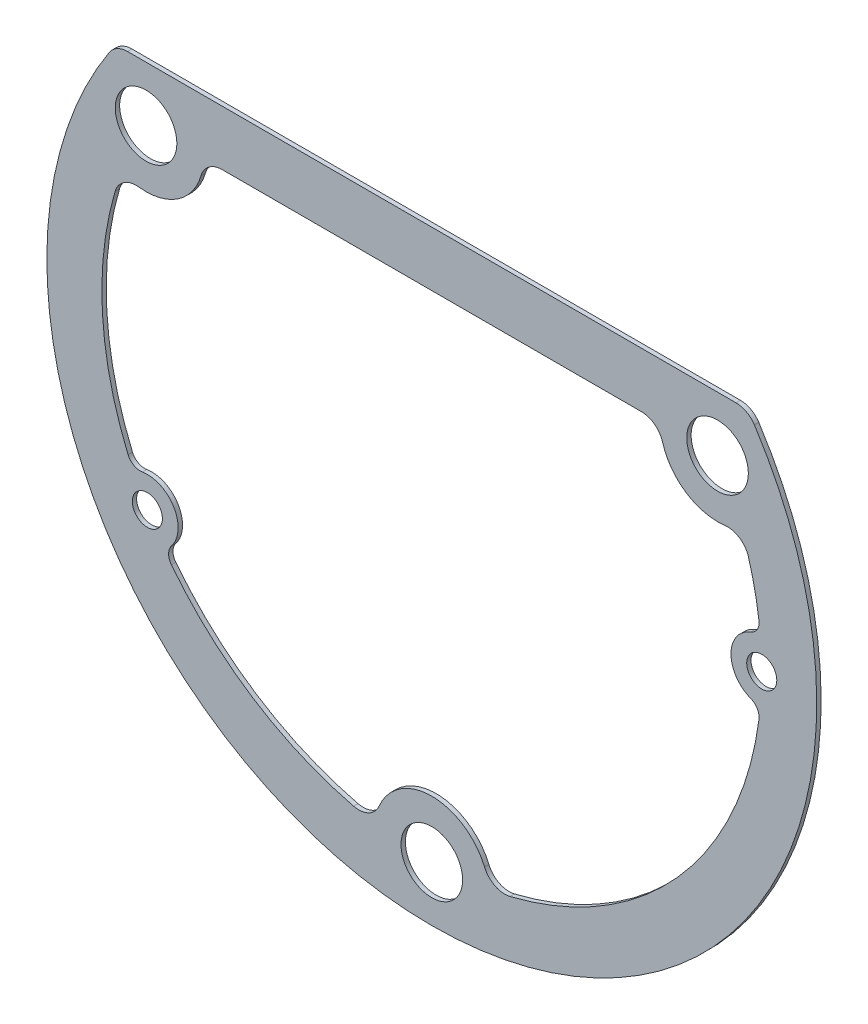
ISO-10303-21;
HEADER;
FILE_DESCRIPTION(('STEP AP214'),'2;1');
FILE_NAME('part.step','',(''),(''),'','','');
FILE_SCHEMA(('AUTOMOTIVE_DESIGN { 1 0 10303 214 1 1 1 1 }'));
ENDSEC;
DATA;
#1=APPLICATION_CONTEXT('core data for automotive mechanical design processes');
#2=APPLICATION_PROTOCOL_DEFINITION('international standard','automotive_design',2000,#1);
#3=PRODUCT_CONTEXT('',#1,'mechanical');
#4=PRODUCT('Part','Part','',(#3));
#5=PRODUCT_RELATED_PRODUCT_CATEGORY('part','',(#4));
#6=PRODUCT_DEFINITION_FORMATION('','',#4);
#7=PRODUCT_DEFINITION_CONTEXT('part definition',#1,'design');
#8=PRODUCT_DEFINITION('design','',#6,#7);
#9=PRODUCT_DEFINITION_SHAPE('','',#8);
#10=(LENGTH_UNIT() NAMED_UNIT(*) SI_UNIT(.MILLI.,.METRE.));
#11=(NAMED_UNIT(*) PLANE_ANGLE_UNIT() SI_UNIT($,.RADIAN.));
#12=(NAMED_UNIT(*) SI_UNIT($,.STERADIAN.) SOLID_ANGLE_UNIT());
#13=UNCERTAINTY_MEASURE_WITH_UNIT(LENGTH_MEASURE(1.E-05),#10,'distance_accuracy_value','');
#14=(GEOMETRIC_REPRESENTATION_CONTEXT(3) GLOBAL_UNCERTAINTY_ASSIGNED_CONTEXT((#13)) GLOBAL_UNIT_ASSIGNED_CONTEXT((#10,
#11,#12)) REPRESENTATION_CONTEXT('',''));
#15=CARTESIAN_POINT('',(0.,0.,0.));
#16=DIRECTION('',(0.,0.,1.));
#17=DIRECTION('',(1.,0.,0.));
#18=AXIS2_PLACEMENT_3D('',#15,#16,#17);
#19=CARTESIAN_POINT('',(69.1465834296966,45.,1.));
#20=DIRECTION('',(0.,0.,1.));
#21=DIRECTION('',(1.,0.,0.));
#22=AXIS2_PLACEMENT_3D('',#19,#20,#21);
#23=PLANE('',#22);
#24=CARTESIAN_POINT('',(75.,-5.2372220082647E-13,1.));
#25=DIRECTION('',(0.,0.,1.));
#26=DIRECTION('',(1.,0.,0.));
#27=AXIS2_PLACEMENT_3D('',#24,#25,#26);
#28=CIRCLE('',#27,3.4186046511628);
#29=CARTESIAN_POINT('',(78.4186046511628,-5.2372220082647E-13,1.));
#30=VERTEX_POINT('',#29);
#31=EDGE_CURVE('E462',#30,#30,#28,.T.);
#32=ORIENTED_EDGE('',*,*,#31,.F.);
#33=EDGE_LOOP('',(#32));
#34=FACE_BOUND('',#33,.T.);
#35=CARTESIAN_POINT('',(-64.6606526413089,-38.,1.));
#36=DIRECTION('',(0.,0.,1.));
#37=DIRECTION('',(1.,0.,0.));
#38=AXIS2_PLACEMENT_3D('',#35,#36,#37);
#39=CIRCLE('',#38,3.4186046511628);
#40=CARTESIAN_POINT('',(-61.2420479901461,-38.,1.));
#41=VERTEX_POINT('',#40);
#42=EDGE_CURVE('E461',#41,#41,#39,.T.);
#43=ORIENTED_EDGE('',*,*,#42,.F.);
#44=EDGE_LOOP('',(#43));
#45=FACE_BOUND('',#44,.T.);
#46=CARTESIAN_POINT('',(64.95,37.5032998548128,1.));
#47=DIRECTION('',(0.,0.,1.));
#48=DIRECTION('',(1.,0.,0.));
#49=AXIS2_PLACEMENT_3D('',#46,#47,#48);
#50=CIRCLE('',#49,7.);
#51=CARTESIAN_POINT('',(71.95,37.5032998548128,1.));
#52=VERTEX_POINT('',#51);
#53=EDGE_CURVE('E485',#52,#52,#50,.T.);
#54=ORIENTED_EDGE('',*,*,#53,.F.);
#55=EDGE_LOOP('',(#54));
#56=FACE_BOUND('',#55,.T.);
#57=CARTESIAN_POINT('',(0.,0.,1.));
#58=DIRECTION('',(0.,0.,1.));
#59=DIRECTION('',(1.,0.,0.));
#60=AXIS2_PLACEMENT_3D('',#57,#58,#59);
#61=CIRCLE('',#60,75.);
#62=CARTESIAN_POINT('',(17.7706462276119,-72.8642857142858,1.));
#63=VERTEX_POINT('',#62);
#64=CARTESIAN_POINT('',(74.3680555555555,-9.71557064128577,1.));
#65=VERTEX_POINT('',#64);
#66=EDGE_CURVE('E220',#63,#65,#61,.T.);
#67=ORIENTED_EDGE('',*,*,#66,.F.);
#68=CARTESIAN_POINT('',(16.5859364791045,-68.0066666666667,1.));
#69=DIRECTION('',(0.,0.,1.));
#70=DIRECTION('',(-1.,0.,0.));
#71=AXIS2_PLACEMENT_3D('',#68,#69,#70);
#72=CIRCLE('',#71,5.);
#73=CARTESIAN_POINT('',(11.9787319015755,-69.9492592592593,1.));
#74=VERTEX_POINT('',#73);
#75=EDGE_CURVE('E211',#74,#63,#72,.T.);
#76=ORIENTED_EDGE('',*,*,#75,.F.);
#77=CARTESIAN_POINT('',(0.,-75.,1.));
#78=DIRECTION('',(0.,0.,-1.));
#79=DIRECTION('',(1.,0.,0.));
#80=AXIS2_PLACEMENT_3D('',#77,#78,#79);
#81=CIRCLE('',#80,13.);
#82=CARTESIAN_POINT('',(-11.9787319015755,-69.9492592592593,1.));
#83=VERTEX_POINT('',#82);
#84=EDGE_CURVE('E290',#83,#74,#81,.T.);
#85=ORIENTED_EDGE('',*,*,#84,.F.);
#86=CARTESIAN_POINT('',(-16.5859364791045,-68.0066666666667,1.));
#87=DIRECTION('',(0.,0.,1.));
#88=DIRECTION('',(-1.,0.,0.));
#89=AXIS2_PLACEMENT_3D('',#86,#87,#88);
#90=CIRCLE('',#89,5.);
#91=CARTESIAN_POINT('',(-17.770646227612,-72.8642857142857,1.));
#92=VERTEX_POINT('',#91);
#93=EDGE_CURVE('E287',#92,#83,#90,.T.);
#94=ORIENTED_EDGE('',*,*,#93,.F.);
#95=CARTESIAN_POINT('',(0.,0.,1.));
#96=DIRECTION('',(0.,0.,1.));
#97=DIRECTION('',(1.,0.,0.));
#98=AXIS2_PLACEMENT_3D('',#95,#96,#97);
#99=CIRCLE('',#98,75.);
#100=CARTESIAN_POINT('',(-59.1932709802466,-46.0560166607914,1.));
#101=VERTEX_POINT('',#100);
#102=EDGE_CURVE('E284',#101,#92,#99,.T.);
#103=ORIENTED_EDGE('',*,*,#102,.F.);
#104=CARTESIAN_POINT('',(-56.8255401410368,-44.2137759943598,1.));
#105=DIRECTION('',(0.,0.,1.));
#106=DIRECTION('',(1.,0.,0.));
#107=AXIS2_PLACEMENT_3D('',#104,#105,#106);
#108=CIRCLE('',#107,3.);
#109=CARTESIAN_POINT('',(-59.1760738911184,-42.3496431960518,1.));
#110=VERTEX_POINT('',#109);
#111=EDGE_CURVE('E281',#110,#101,#108,.T.);
#112=ORIENTED_EDGE('',*,*,#111,.F.);
#113=CARTESIAN_POINT('',(-64.6606526413089,-38.,1.));
#114=DIRECTION('',(0.,0.,-1.));
#115=DIRECTION('',(1.,0.,0.));
#116=AXIS2_PLACEMENT_3D('',#113,#114,#115);
#117=CIRCLE('',#116,7.00000000000006);
#118=CARTESIAN_POINT('',(-65.791988875008,-31.0920279150593,1.));
#119=VERTEX_POINT('',#118);
#120=EDGE_CURVE('E278',#119,#110,#117,.T.);
#121=ORIENTED_EDGE('',*,*,#120,.F.);
#122=CARTESIAN_POINT('',(-66.2768472608791,-28.1314684500847,1.));
#123=DIRECTION('',(0.,0.,1.));
#124=DIRECTION('',(-1.,0.,0.));
#125=AXIS2_PLACEMENT_3D('',#122,#123,#124);
#126=CIRCLE('',#125,3.);
#127=CARTESIAN_POINT('',(-69.0383825634157,-29.3036129688382,1.));
#128=VERTEX_POINT('',#127);
#129=EDGE_CURVE('E275',#128,#119,#126,.T.);
#130=ORIENTED_EDGE('',*,*,#129,.F.);
#131=CARTESIAN_POINT('',(0.,0.,1.));
#132=DIRECTION('',(0.,0.,1.));
#133=DIRECTION('',(1.,0.,0.));
#134=AXIS2_PLACEMENT_3D('',#131,#132,#133);
#135=CIRCLE('',#134,75.);
#136=CARTESIAN_POINT('',(-71.9865764164105,21.0459691115495,1.));
#137=VERTEX_POINT('',#136);
#138=EDGE_CURVE('E272',#137,#128,#135,.T.);
#139=ORIENTED_EDGE('',*,*,#138,.F.);
#140=CARTESIAN_POINT('',(-67.1874713219832,19.6429045041129,1.));
#141=DIRECTION('',(0.,0.,1.));
#142=DIRECTION('',(-1.,0.,0.));
#143=AXIS2_PLACEMENT_3D('',#140,#141,#142);
#144=CIRCLE('',#143,5.);
#145=CARTESIAN_POINT('',(-66.5659515103212,24.6041254348629,1.));
#146=VERTEX_POINT('',#145);
#147=EDGE_CURVE('E269',#146,#137,#144,.T.);
#148=ORIENTED_EDGE('',*,*,#147,.F.);
#149=CARTESIAN_POINT('',(-64.95,37.5032998548128,1.));
#150=DIRECTION('',(0.,0.,-1.));
#151=DIRECTION('',(1.,0.,0.));
#152=AXIS2_PLACEMENT_3D('',#149,#150,#151);
#153=CIRCLE('',#152,13.);
#154=CARTESIAN_POINT('',(-52.4616103302624,33.8921887437017,1.));
#155=VERTEX_POINT('',#154);
#156=EDGE_CURVE('E266',#155,#146,#153,.T.);
#157=ORIENTED_EDGE('',*,*,#156,.F.);
#158=CARTESIAN_POINT('',(-47.6583835342094,32.5032998548128,1.));
#159=DIRECTION('',(0.,0.,1.));
#160=DIRECTION('',(1.,0.,0.));
#161=AXIS2_PLACEMENT_3D('',#158,#159,#160);
#162=CIRCLE('',#161,5.);
#163=CARTESIAN_POINT('',(-47.6583835342094,37.5032998548128,1.));
#164=VERTEX_POINT('',#163);
#165=EDGE_CURVE('E263',#164,#155,#162,.T.);
#166=ORIENTED_EDGE('',*,*,#165,.F.);
#167=DIRECTION('',(-1.,0.,0.));
#168=VECTOR('',#167,1.);
#169=CARTESIAN_POINT('',(-47.6583835342094,37.5032998548128,1.));
#170=LINE('',#169,#168);
#171=CARTESIAN_POINT('',(47.6583835342095,37.5032998548127,1.));
#172=VERTEX_POINT('',#171);
#173=EDGE_CURVE('E260',#172,#164,#170,.T.);
#174=ORIENTED_EDGE('',*,*,#173,.F.);
#175=CARTESIAN_POINT('',(47.6583835342094,32.5032998548127,1.));
#176=DIRECTION('',(0.,0.,1.));
#177=DIRECTION('',(-1.,0.,0.));
#178=AXIS2_PLACEMENT_3D('',#175,#176,#177);
#179=CIRCLE('',#178,5.);
#180=CARTESIAN_POINT('',(52.4616103302624,33.8921887437016,1.));
#181=VERTEX_POINT('',#180);
#182=EDGE_CURVE('E257',#181,#172,#179,.T.);
#183=ORIENTED_EDGE('',*,*,#182,.F.);
#184=CARTESIAN_POINT('',(64.95,37.5032998548128,1.));
#185=DIRECTION('',(0.,0.,-1.));
#186=DIRECTION('',(1.,0.,0.));
#187=AXIS2_PLACEMENT_3D('',#184,#185,#186);
#188=CIRCLE('',#187,13.);
#189=CARTESIAN_POINT('',(66.5659515103212,24.6041254348629,1.));
#190=VERTEX_POINT('',#189);
#191=EDGE_CURVE('E254',#190,#181,#188,.T.);
#192=ORIENTED_EDGE('',*,*,#191,.F.);
#193=CARTESIAN_POINT('',(67.1874713219832,19.6429045041129,1.));
#194=DIRECTION('',(0.,0.,1.));
#195=DIRECTION('',(1.,0.,0.));
#196=AXIS2_PLACEMENT_3D('',#193,#194,#195);
#197=CIRCLE('',#196,5.);
#198=CARTESIAN_POINT('',(71.9865764164105,21.0459691115495,1.));
#199=VERTEX_POINT('',#198);
#200=EDGE_CURVE('E251',#199,#190,#197,.T.);
#201=ORIENTED_EDGE('',*,*,#200,.F.);
#202=CARTESIAN_POINT('',(0.,0.,1.));
#203=DIRECTION('',(0.,0.,1.));
#204=DIRECTION('',(1.,0.,0.));
#205=AXIS2_PLACEMENT_3D('',#202,#203,#204);
#206=CIRCLE('',#205,75.);
#207=CARTESIAN_POINT('',(74.3680555555557,9.7155706412847,1.));
#208=VERTEX_POINT('',#207);
#209=EDGE_CURVE('E248',#208,#199,#206,.T.);
#210=ORIENTED_EDGE('',*,*,#209,.F.);
#211=CARTESIAN_POINT('',(71.3933333333334,9.32694781563331,1.));
#212=DIRECTION('',(0.,0.,1.));
#213=DIRECTION('',(-1.,0.,0.));
#214=AXIS2_PLACEMENT_3D('',#211,#212,#213);
#215=CIRCLE('',#214,3.);
#216=CARTESIAN_POINT('',(72.4753333333334,6.52886347094318,1.));
#217=VERTEX_POINT('',#216);
#218=EDGE_CURVE('E245',#217,#208,#215,.T.);
#219=ORIENTED_EDGE('',*,*,#218,.F.);
#220=CARTESIAN_POINT('',(75.,-5.2372220082647E-13,1.));
#221=DIRECTION('',(0.,0.,-1.));
#222=DIRECTION('',(1.,0.,0.));
#223=AXIS2_PLACEMENT_3D('',#220,#221,#222);
#224=CIRCLE('',#223,7.00000000000003);
#225=CARTESIAN_POINT('',(72.4753333333333,-6.52886347094418,1.));
#226=VERTEX_POINT('',#225);
#227=EDGE_CURVE('E239',#226,#217,#224,.T.);
#228=ORIENTED_EDGE('',*,*,#227,.F.);
#229=CARTESIAN_POINT('',(71.3933333333333,-9.32694781563431,1.));
#230=DIRECTION('',(0.,0.,1.));
#231=DIRECTION('',(1.,0.,0.));
#232=AXIS2_PLACEMENT_3D('',#229,#230,#231);
#233=CIRCLE('',#232,3.);
#234=EDGE_CURVE('E235',#65,#226,#233,.T.);
#235=ORIENTED_EDGE('',*,*,#234,.F.);
#236=EDGE_LOOP('',(#67,#76,#85,#94,#103,#112,#121,#130,#139,#148,#157,#166,#174,#183,#192,#201,
#210,#219,#228,#235));
#237=FACE_BOUND('',#236,.T.);
#238=CARTESIAN_POINT('',(69.1465834296966,45.,1.));
#239=DIRECTION('',(0.,0.,1.));
#240=DIRECTION('',(1.,0.,0.));
#241=AXIS2_PLACEMENT_3D('',#238,#239,#240);
#242=CIRCLE('',#241,5.);
#243=CARTESIAN_POINT('',(73.3372854557389,47.7272727272728,1.));
#244=VERTEX_POINT('',#243);
#245=CARTESIAN_POINT('',(69.1465834296966,50.,1.));
#246=VERTEX_POINT('',#245);
#247=EDGE_CURVE('E423',#244,#246,#242,.T.);
#248=ORIENTED_EDGE('',*,*,#247,.T.);
#249=DIRECTION('',(-1.,0.,0.));
#250=VECTOR('',#249,1.);
#251=CARTESIAN_POINT('',(-69.1465834296966,50.,1.));
#252=LINE('',#251,#250);
#253=CARTESIAN_POINT('',(-69.1465834296966,50.,1.));
#254=VERTEX_POINT('',#253);
#255=EDGE_CURVE('E427',#246,#254,#252,.T.);
#256=ORIENTED_EDGE('',*,*,#255,.T.);
#257=CARTESIAN_POINT('',(-69.1465834296966,45.,1.));
#258=DIRECTION('',(0.,0.,1.));
#259=DIRECTION('',(1.,0.,0.));
#260=AXIS2_PLACEMENT_3D('',#257,#258,#259);
#261=CIRCLE('',#260,5.);
#262=CARTESIAN_POINT('',(-73.3372854557389,47.7272727272727,1.));
#263=VERTEX_POINT('',#262);
#264=EDGE_CURVE('E431',#254,#263,#261,.T.);
#265=ORIENTED_EDGE('',*,*,#264,.T.);
#266=CARTESIAN_POINT('',(0.,0.,1.));
#267=DIRECTION('',(0.,0.,1.));
#268=DIRECTION('',(1.,0.,0.));
#269=AXIS2_PLACEMENT_3D('',#266,#267,#268);
#270=CIRCLE('',#269,87.5);
#271=EDGE_CURVE('E434',#263,#244,#270,.T.);
#272=ORIENTED_EDGE('',*,*,#271,.T.);
#273=EDGE_LOOP('',(#248,#256,#265,#272));
#274=FACE_BOUND('',#273,.T.);
#275=CARTESIAN_POINT('',(-64.95,37.5032998548128,1.));
#276=DIRECTION('',(0.,0.,1.));
#277=DIRECTION('',(1.,0.,0.));
#278=AXIS2_PLACEMENT_3D('',#275,#276,#277);
#279=CIRCLE('',#278,7.);
#280=CARTESIAN_POINT('',(-57.95,37.5032998548128,1.));
#281=VERTEX_POINT('',#280);
#282=EDGE_CURVE('E295',#281,#281,#279,.T.);
#283=ORIENTED_EDGE('',*,*,#282,.F.);
#284=EDGE_LOOP('',(#283));
#285=FACE_BOUND('',#284,.T.);
#286=CARTESIAN_POINT('',(0.,-75.,1.));
#287=DIRECTION('',(0.,0.,1.));
#288=DIRECTION('',(1.,0.,0.));
#289=AXIS2_PLACEMENT_3D('',#286,#287,#288);
#290=CIRCLE('',#289,7.);
#291=CARTESIAN_POINT('',(7.00000000000002,-75.,1.));
#292=VERTEX_POINT('',#291);
#293=EDGE_CURVE('E477',#292,#292,#290,.T.);
#294=ORIENTED_EDGE('',*,*,#293,.F.);
#295=EDGE_LOOP('',(#294));
#296=FACE_BOUND('',#295,.T.);
#297=ADVANCED_FACE('F47',(#34,#45,#56,#237,#274,#285,#296),#23,.T.);
#298=CARTESIAN_POINT('',(69.1465834296966,45.,0.));
#299=DIRECTION('',(0.,0.,1.));
#300=DIRECTION('',(1.,0.,0.));
#301=AXIS2_PLACEMENT_3D('',#298,#299,#300);
#302=PLANE('',#301);
#303=CARTESIAN_POINT('',(75.,-5.2372220082647E-13,0.));
#304=DIRECTION('',(0.,0.,1.));
#305=DIRECTION('',(1.,0.,0.));
#306=AXIS2_PLACEMENT_3D('',#303,#304,#305);
#307=CIRCLE('',#306,3.43604651162791);
#308=CARTESIAN_POINT('',(78.4360465116279,-5.2372220082647E-13,0.));
#309=VERTEX_POINT('',#308);
#310=EDGE_CURVE('E51',#309,#309,#307,.T.);
#311=ORIENTED_EDGE('',*,*,#310,.T.);
#312=EDGE_LOOP('',(#311));
#313=FACE_BOUND('',#312,.T.);
#314=CARTESIAN_POINT('',(-64.6606526413089,-38.,0.));
#315=DIRECTION('',(0.,0.,1.));
#316=DIRECTION('',(1.,0.,0.));
#317=AXIS2_PLACEMENT_3D('',#314,#315,#316);
#318=CIRCLE('',#317,3.43604651162791);
#319=CARTESIAN_POINT('',(-61.2246061296809,-38.,0.));
#320=VERTEX_POINT('',#319);
#321=EDGE_CURVE('E458',#320,#320,#318,.T.);
#322=ORIENTED_EDGE('',*,*,#321,.T.);
#323=EDGE_LOOP('',(#322));
#324=FACE_BOUND('',#323,.T.);
#325=CARTESIAN_POINT('',(69.1465834296966,45.,0.));
#326=DIRECTION('',(0.,0.,1.));
#327=DIRECTION('',(1.,0.,0.));
#328=AXIS2_PLACEMENT_3D('',#325,#326,#327);
#329=CIRCLE('',#328,5.);
#330=CARTESIAN_POINT('',(73.3372854557389,47.7272727272728,0.));
#331=VERTEX_POINT('',#330);
#332=CARTESIAN_POINT('',(69.1465834296966,50.,0.));
#333=VERTEX_POINT('',#332);
#334=EDGE_CURVE('E229',#331,#333,#329,.T.);
#335=ORIENTED_EDGE('',*,*,#334,.F.);
#336=CARTESIAN_POINT('',(0.,0.,0.));
#337=DIRECTION('',(0.,0.,1.));
#338=DIRECTION('',(1.,0.,0.));
#339=AXIS2_PLACEMENT_3D('',#336,#337,#338);
#340=CIRCLE('',#339,87.5);
#341=CARTESIAN_POINT('',(-73.3372854557389,47.7272727272727,0.));
#342=VERTEX_POINT('',#341);
#343=EDGE_CURVE('E428',#342,#331,#340,.T.);
#344=ORIENTED_EDGE('',*,*,#343,.F.);
#345=CARTESIAN_POINT('',(-69.1465834296966,45.,0.));
#346=DIRECTION('',(0.,0.,1.));
#347=DIRECTION('',(1.,0.,0.));
#348=AXIS2_PLACEMENT_3D('',#345,#346,#347);
#349=CIRCLE('',#348,5.);
#350=CARTESIAN_POINT('',(-69.1465834296966,50.,0.));
#351=VERTEX_POINT('',#350);
#352=EDGE_CURVE('E444',#351,#342,#349,.T.);
#353=ORIENTED_EDGE('',*,*,#352,.F.);
#354=DIRECTION('',(-1.,0.,0.));
#355=VECTOR('',#354,1.);
#356=CARTESIAN_POINT('',(-69.1465834296966,50.,0.));
#357=LINE('',#356,#355);
#358=EDGE_CURVE('E441',#333,#351,#357,.T.);
#359=ORIENTED_EDGE('',*,*,#358,.F.);
#360=EDGE_LOOP('',(#335,#344,#353,#359));
#361=FACE_BOUND('',#360,.T.);
#362=CARTESIAN_POINT('',(16.5859364791045,-68.0066666666667,0.));
#363=DIRECTION('',(0.,0.,1.));
#364=DIRECTION('',(-1.,0.,0.));
#365=AXIS2_PLACEMENT_3D('',#362,#363,#364);
#366=CIRCLE('',#365,5.);
#367=CARTESIAN_POINT('',(11.9787319015755,-69.9492592592593,0.));
#368=VERTEX_POINT('',#367);
#369=CARTESIAN_POINT('',(17.7706462276119,-72.8642857142858,0.));
#370=VERTEX_POINT('',#369);
#371=EDGE_CURVE('E73',#368,#370,#366,.T.);
#372=ORIENTED_EDGE('',*,*,#371,.T.);
#373=CARTESIAN_POINT('',(0.,0.,0.));
#374=DIRECTION('',(0.,0.,1.));
#375=DIRECTION('',(1.,0.,0.));
#376=AXIS2_PLACEMENT_3D('',#373,#374,#375);
#377=CIRCLE('',#376,75.);
#378=CARTESIAN_POINT('',(74.3680555555555,-9.71557064128577,0.));
#379=VERTEX_POINT('',#378);
#380=EDGE_CURVE('E227',#370,#379,#377,.T.);
#381=ORIENTED_EDGE('',*,*,#380,.T.);
#382=CARTESIAN_POINT('',(71.3933333333333,-9.32694781563431,0.));
#383=DIRECTION('',(0.,0.,1.));
#384=DIRECTION('',(1.,0.,0.));
#385=AXIS2_PLACEMENT_3D('',#382,#383,#384);
#386=CIRCLE('',#385,3.);
#387=CARTESIAN_POINT('',(72.4753333333333,-6.52886347094418,0.));
#388=VERTEX_POINT('',#387);
#389=EDGE_CURVE('E298',#379,#388,#386,.T.);
#390=ORIENTED_EDGE('',*,*,#389,.T.);
#391=CARTESIAN_POINT('',(75.,-5.2372220082647E-13,0.));
#392=DIRECTION('',(0.,0.,-1.));
#393=DIRECTION('',(1.,0.,0.));
#394=AXIS2_PLACEMENT_3D('',#391,#392,#393);
#395=CIRCLE('',#394,7.00000000000003);
#396=CARTESIAN_POINT('',(72.4753333333334,6.52886347094318,0.));
#397=VERTEX_POINT('',#396);
#398=EDGE_CURVE('E302',#388,#397,#395,.T.);
#399=ORIENTED_EDGE('',*,*,#398,.T.);
#400=CARTESIAN_POINT('',(71.3933333333334,9.32694781563331,0.));
#401=DIRECTION('',(0.,0.,1.));
#402=DIRECTION('',(-1.,0.,0.));
#403=AXIS2_PLACEMENT_3D('',#400,#401,#402);
#404=CIRCLE('',#403,3.);
#405=CARTESIAN_POINT('',(74.3680555555557,9.7155706412847,0.));
#406=VERTEX_POINT('',#405);
#407=EDGE_CURVE('E306',#397,#406,#404,.T.);
#408=ORIENTED_EDGE('',*,*,#407,.T.);
#409=CARTESIAN_POINT('',(0.,0.,0.));
#410=DIRECTION('',(0.,0.,1.));
#411=DIRECTION('',(1.,0.,0.));
#412=AXIS2_PLACEMENT_3D('',#409,#410,#411);
#413=CIRCLE('',#412,75.);
#414=CARTESIAN_POINT('',(71.9865764164105,21.0459691115495,0.));
#415=VERTEX_POINT('',#414);
#416=EDGE_CURVE('E310',#406,#415,#413,.T.);
#417=ORIENTED_EDGE('',*,*,#416,.T.);
#418=CARTESIAN_POINT('',(67.1874713219832,19.6429045041129,0.));
#419=DIRECTION('',(0.,0.,1.));
#420=DIRECTION('',(1.,0.,0.));
#421=AXIS2_PLACEMENT_3D('',#418,#419,#420);
#422=CIRCLE('',#421,5.);
#423=CARTESIAN_POINT('',(66.5659515103212,24.6041254348629,0.));
#424=VERTEX_POINT('',#423);
#425=EDGE_CURVE('E314',#415,#424,#422,.T.);
#426=ORIENTED_EDGE('',*,*,#425,.T.);
#427=CARTESIAN_POINT('',(64.95,37.5032998548128,0.));
#428=DIRECTION('',(0.,0.,-1.));
#429=DIRECTION('',(1.,0.,0.));
#430=AXIS2_PLACEMENT_3D('',#427,#428,#429);
#431=CIRCLE('',#430,13.);
#432=CARTESIAN_POINT('',(52.4616103302624,33.8921887437016,0.));
#433=VERTEX_POINT('',#432);
#434=EDGE_CURVE('E318',#424,#433,#431,.T.);
#435=ORIENTED_EDGE('',*,*,#434,.T.);
#436=CARTESIAN_POINT('',(47.6583835342094,32.5032998548127,0.));
#437=DIRECTION('',(0.,0.,1.));
#438=DIRECTION('',(-1.,0.,0.));
#439=AXIS2_PLACEMENT_3D('',#436,#437,#438);
#440=CIRCLE('',#439,5.);
#441=CARTESIAN_POINT('',(47.6583835342095,37.5032998548127,0.));
#442=VERTEX_POINT('',#441);
#443=EDGE_CURVE('E322',#433,#442,#440,.T.);
#444=ORIENTED_EDGE('',*,*,#443,.T.);
#445=DIRECTION('',(-1.,0.,0.));
#446=VECTOR('',#445,1.);
#447=CARTESIAN_POINT('',(-47.6583835342094,37.5032998548128,0.));
#448=LINE('',#447,#446);
#449=CARTESIAN_POINT('',(-47.6583835342094,37.5032998548128,0.));
#450=VERTEX_POINT('',#449);
#451=EDGE_CURVE('E326',#442,#450,#448,.T.);
#452=ORIENTED_EDGE('',*,*,#451,.T.);
#453=CARTESIAN_POINT('',(-47.6583835342094,32.5032998548128,0.));
#454=DIRECTION('',(0.,0.,1.));
#455=DIRECTION('',(1.,0.,0.));
#456=AXIS2_PLACEMENT_3D('',#453,#454,#455);
#457=CIRCLE('',#456,5.);
#458=CARTESIAN_POINT('',(-52.4616103302624,33.8921887437017,0.));
#459=VERTEX_POINT('',#458);
#460=EDGE_CURVE('E330',#450,#459,#457,.T.);
#461=ORIENTED_EDGE('',*,*,#460,.T.);
#462=CARTESIAN_POINT('',(-64.95,37.5032998548128,0.));
#463=DIRECTION('',(0.,0.,-1.));
#464=DIRECTION('',(1.,0.,0.));
#465=AXIS2_PLACEMENT_3D('',#462,#463,#464);
#466=CIRCLE('',#465,13.);
#467=CARTESIAN_POINT('',(-66.5659515103212,24.6041254348629,0.));
#468=VERTEX_POINT('',#467);
#469=EDGE_CURVE('E334',#459,#468,#466,.T.);
#470=ORIENTED_EDGE('',*,*,#469,.T.);
#471=CARTESIAN_POINT('',(-67.1874713219832,19.6429045041129,0.));
#472=DIRECTION('',(0.,0.,1.));
#473=DIRECTION('',(-1.,0.,0.));
#474=AXIS2_PLACEMENT_3D('',#471,#472,#473);
#475=CIRCLE('',#474,5.);
#476=CARTESIAN_POINT('',(-71.9865764164105,21.0459691115495,0.));
#477=VERTEX_POINT('',#476);
#478=EDGE_CURVE('E338',#468,#477,#475,.T.);
#479=ORIENTED_EDGE('',*,*,#478,.T.);
#480=CARTESIAN_POINT('',(0.,0.,0.));
#481=DIRECTION('',(0.,0.,1.));
#482=DIRECTION('',(1.,0.,0.));
#483=AXIS2_PLACEMENT_3D('',#480,#481,#482);
#484=CIRCLE('',#483,75.);
#485=CARTESIAN_POINT('',(-69.0383825634157,-29.3036129688382,0.));
#486=VERTEX_POINT('',#485);
#487=EDGE_CURVE('E342',#477,#486,#484,.T.);
#488=ORIENTED_EDGE('',*,*,#487,.T.);
#489=CARTESIAN_POINT('',(-66.2768472608791,-28.1314684500847,0.));
#490=DIRECTION('',(0.,0.,1.));
#491=DIRECTION('',(-1.,0.,0.));
#492=AXIS2_PLACEMENT_3D('',#489,#490,#491);
#493=CIRCLE('',#492,3.);
#494=CARTESIAN_POINT('',(-65.791988875008,-31.0920279150593,0.));
#495=VERTEX_POINT('',#494);
#496=EDGE_CURVE('E346',#486,#495,#493,.T.);
#497=ORIENTED_EDGE('',*,*,#496,.T.);
#498=CARTESIAN_POINT('',(-64.6606526413089,-38.,0.));
#499=DIRECTION('',(0.,0.,-1.));
#500=DIRECTION('',(1.,0.,0.));
#501=AXIS2_PLACEMENT_3D('',#498,#499,#500);
#502=CIRCLE('',#501,7.00000000000006);
#503=CARTESIAN_POINT('',(-59.1760738911184,-42.3496431960518,0.));
#504=VERTEX_POINT('',#503);
#505=EDGE_CURVE('E350',#495,#504,#502,.T.);
#506=ORIENTED_EDGE('',*,*,#505,.T.);
#507=CARTESIAN_POINT('',(-56.8255401410368,-44.2137759943598,0.));
#508=DIRECTION('',(0.,0.,1.));
#509=DIRECTION('',(1.,0.,0.));
#510=AXIS2_PLACEMENT_3D('',#507,#508,#509);
#511=CIRCLE('',#510,3.);
#512=CARTESIAN_POINT('',(-59.1932709802466,-46.0560166607914,0.));
#513=VERTEX_POINT('',#512);
#514=EDGE_CURVE('E354',#504,#513,#511,.T.);
#515=ORIENTED_EDGE('',*,*,#514,.T.);
#516=CARTESIAN_POINT('',(0.,0.,0.));
#517=DIRECTION('',(0.,0.,1.));
#518=DIRECTION('',(1.,0.,0.));
#519=AXIS2_PLACEMENT_3D('',#516,#517,#518);
#520=CIRCLE('',#519,75.);
#521=CARTESIAN_POINT('',(-17.770646227612,-72.8642857142857,0.));
#522=VERTEX_POINT('',#521);
#523=EDGE_CURVE('E358',#513,#522,#520,.T.);
#524=ORIENTED_EDGE('',*,*,#523,.T.);
#525=CARTESIAN_POINT('',(-16.5859364791045,-68.0066666666667,0.));
#526=DIRECTION('',(0.,0.,1.));
#527=DIRECTION('',(-1.,0.,0.));
#528=AXIS2_PLACEMENT_3D('',#525,#526,#527);
#529=CIRCLE('',#528,5.);
#530=CARTESIAN_POINT('',(-11.9787319015755,-69.9492592592593,0.));
#531=VERTEX_POINT('',#530);
#532=EDGE_CURVE('E362',#522,#531,#529,.T.);
#533=ORIENTED_EDGE('',*,*,#532,.T.);
#534=CARTESIAN_POINT('',(0.,-75.,0.));
#535=DIRECTION('',(0.,0.,-1.));
#536=DIRECTION('',(1.,0.,0.));
#537=AXIS2_PLACEMENT_3D('',#534,#535,#536);
#538=CIRCLE('',#537,13.);
#539=EDGE_CURVE('E221',#531,#368,#538,.T.);
#540=ORIENTED_EDGE('',*,*,#539,.T.);
#541=EDGE_LOOP('',(#372,#381,#390,#399,#408,#417,#426,#435,#444,#452,#461,#470,#479,#488,#497,
#506,#515,#524,#533,#540));
#542=FACE_BOUND('',#541,.T.);
#543=CARTESIAN_POINT('',(-64.95,37.5032998548128,0.));
#544=DIRECTION('',(0.,0.,1.));
#545=DIRECTION('',(1.,0.,0.));
#546=AXIS2_PLACEMENT_3D('',#543,#544,#545);
#547=CIRCLE('',#546,7.);
#548=CARTESIAN_POINT('',(-57.95,37.5032998548128,0.));
#549=VERTEX_POINT('',#548);
#550=EDGE_CURVE('E489',#549,#549,#547,.T.);
#551=ORIENTED_EDGE('',*,*,#550,.T.);
#552=EDGE_LOOP('',(#551));
#553=FACE_BOUND('',#552,.T.);
#554=CARTESIAN_POINT('',(64.95,37.5032998548128,0.));
#555=DIRECTION('',(0.,0.,1.));
#556=DIRECTION('',(1.,0.,0.));
#557=AXIS2_PLACEMENT_3D('',#554,#555,#556);
#558=CIRCLE('',#557,7.);
#559=CARTESIAN_POINT('',(71.95,37.5032998548128,0.));
#560=VERTEX_POINT('',#559);
#561=EDGE_CURVE('E481',#560,#560,#558,.T.);
#562=ORIENTED_EDGE('',*,*,#561,.T.);
#563=EDGE_LOOP('',(#562));
#564=FACE_BOUND('',#563,.T.);
#565=CARTESIAN_POINT('',(0.,-75.,0.));
#566=DIRECTION('',(0.,0.,1.));
#567=DIRECTION('',(1.,0.,0.));
#568=AXIS2_PLACEMENT_3D('',#565,#566,#567);
#569=CIRCLE('',#568,7.);
#570=CARTESIAN_POINT('',(7.00000000000002,-75.,0.));
#571=VERTEX_POINT('',#570);
#572=EDGE_CURVE('E468',#571,#571,#569,.T.);
#573=ORIENTED_EDGE('',*,*,#572,.T.);
#574=EDGE_LOOP('',(#573));
#575=FACE_BOUND('',#574,.T.);
#576=ADVANCED_FACE('F499',(#313,#324,#361,#542,#553,#564,#575),#302,.F.);
#577=CARTESIAN_POINT('',(69.1465834296966,45.,1.));
#578=DIRECTION('',(0.,0.,-1.));
#579=DIRECTION('',(-1.,0.,0.));
#580=AXIS2_PLACEMENT_3D('',#577,#578,#579);
#581=CYLINDRICAL_SURFACE('',#580,5.);
#582=ORIENTED_EDGE('',*,*,#334,.T.);
#583=DIRECTION('',(0.,0.,-1.));
#584=VECTOR('',#583,1.);
#585=CARTESIAN_POINT('',(69.1465834296966,50.,1.));
#586=LINE('',#585,#584);
#587=EDGE_CURVE('E12',#246,#333,#586,.T.);
#588=ORIENTED_EDGE('',*,*,#587,.F.);
#589=ORIENTED_EDGE('',*,*,#247,.F.);
#590=DIRECTION('',(0.,0.,-1.));
#591=VECTOR('',#590,1.);
#592=CARTESIAN_POINT('',(73.3372854557389,47.7272727272728,1.));
#593=LINE('',#592,#591);
#594=EDGE_CURVE('E437',#244,#331,#593,.T.);
#595=ORIENTED_EDGE('',*,*,#594,.T.);
#596=EDGE_LOOP('',(#582,#588,#589,#595));
#597=FACE_BOUND('',#596,.T.);
#598=ADVANCED_FACE('F49',(#597),#581,.T.);
#599=CARTESIAN_POINT('',(-69.1465834296966,50.,1.));
#600=DIRECTION('',(0.,-1.,0.));
#601=DIRECTION('',(0.,0.,-1.));
#602=AXIS2_PLACEMENT_3D('',#599,#600,#601);
#603=PLANE('',#602);
#604=ORIENTED_EDGE('',*,*,#358,.T.);
#605=DIRECTION('',(0.,0.,-1.));
#606=VECTOR('',#605,1.);
#607=CARTESIAN_POINT('',(-69.1465834296966,50.,1.));
#608=LINE('',#607,#606);
#609=EDGE_CURVE('E57',#254,#351,#608,.T.);
#610=ORIENTED_EDGE('',*,*,#609,.F.);
#611=ORIENTED_EDGE('',*,*,#255,.F.);
#612=ORIENTED_EDGE('',*,*,#587,.T.);
#613=EDGE_LOOP('',(#604,#610,#611,#612));
#614=FACE_BOUND('',#613,.T.);
#615=ADVANCED_FACE('F535',(#614),#603,.F.);
#616=CARTESIAN_POINT('',(-69.1465834296966,45.,1.));
#617=DIRECTION('',(0.,0.,-1.));
#618=DIRECTION('',(-1.,0.,0.));
#619=AXIS2_PLACEMENT_3D('',#616,#617,#618);
#620=CYLINDRICAL_SURFACE('',#619,5.);
#621=ORIENTED_EDGE('',*,*,#352,.T.);
#622=DIRECTION('',(0.,0.,-1.));
#623=VECTOR('',#622,1.);
#624=CARTESIAN_POINT('',(-73.3372854557389,47.7272727272727,1.));
#625=LINE('',#624,#623);
#626=EDGE_CURVE('E452',#263,#342,#625,.T.);
#627=ORIENTED_EDGE('',*,*,#626,.F.);
#628=ORIENTED_EDGE('',*,*,#264,.F.);
#629=ORIENTED_EDGE('',*,*,#609,.T.);
#630=EDGE_LOOP('',(#621,#627,#628,#629));
#631=FACE_BOUND('',#630,.T.);
#632=ADVANCED_FACE('F532',(#631),#620,.T.);
#633=CARTESIAN_POINT('',(0.,0.,1.));
#634=DIRECTION('',(0.,0.,-1.));
#635=DIRECTION('',(-1.,0.,0.));
#636=AXIS2_PLACEMENT_3D('',#633,#634,#635);
#637=CYLINDRICAL_SURFACE('',#636,87.5);
#638=ORIENTED_EDGE('',*,*,#343,.T.);
#639=ORIENTED_EDGE('',*,*,#594,.F.);
#640=ORIENTED_EDGE('',*,*,#271,.F.);
#641=ORIENTED_EDGE('',*,*,#626,.T.);
#642=EDGE_LOOP('',(#638,#639,#640,#641));
#643=FACE_BOUND('',#642,.T.);
#644=ADVANCED_FACE('F529',(#643),#637,.T.);
#645=CARTESIAN_POINT('',(16.5859364791045,-68.0066666666667,1.));
#646=DIRECTION('',(0.,0.,-1.));
#647=DIRECTION('',(-1.,0.,0.));
#648=AXIS2_PLACEMENT_3D('',#645,#646,#647);
#649=CYLINDRICAL_SURFACE('',#648,5.);
#650=ORIENTED_EDGE('',*,*,#371,.F.);
#651=DIRECTION('',(0.,0.,-1.));
#652=VECTOR('',#651,1.);
#653=CARTESIAN_POINT('',(11.9787319015755,-69.9492592592593,1.));
#654=LINE('',#653,#652);
#655=EDGE_CURVE('E215',#74,#368,#654,.T.);
#656=ORIENTED_EDGE('',*,*,#655,.F.);
#657=ORIENTED_EDGE('',*,*,#75,.T.);
#658=DIRECTION('',(0.,0.,-1.));
#659=VECTOR('',#658,1.);
#660=CARTESIAN_POINT('',(17.7706462276119,-72.8642857142858,1.));
#661=LINE('',#660,#659);
#662=EDGE_CURVE('E214',#63,#370,#661,.T.);
#663=ORIENTED_EDGE('',*,*,#662,.T.);
#664=EDGE_LOOP('',(#650,#656,#657,#663));
#665=FACE_BOUND('',#664,.T.);
#666=ADVANCED_FACE('F213',(#665),#649,.F.);
#667=CARTESIAN_POINT('',(0.,0.,1.));
#668=DIRECTION('',(0.,0.,-1.));
#669=DIRECTION('',(-1.,0.,0.));
#670=AXIS2_PLACEMENT_3D('',#667,#668,#669);
#671=CYLINDRICAL_SURFACE('',#670,75.);
#672=ORIENTED_EDGE('',*,*,#380,.F.);
#673=ORIENTED_EDGE('',*,*,#662,.F.);
#674=ORIENTED_EDGE('',*,*,#66,.T.);
#675=DIRECTION('',(0.,0.,-1.));
#676=VECTOR('',#675,1.);
#677=CARTESIAN_POINT('',(74.3680555555555,-9.71557064128577,1.));
#678=LINE('',#677,#676);
#679=EDGE_CURVE('E230',#65,#379,#678,.T.);
#680=ORIENTED_EDGE('',*,*,#679,.T.);
#681=EDGE_LOOP('',(#672,#673,#674,#680));
#682=FACE_BOUND('',#681,.T.);
#683=ADVANCED_FACE('F224',(#682),#671,.F.);
#684=CARTESIAN_POINT('',(71.3933333333333,-9.32694781563431,1.));
#685=DIRECTION('',(0.,0.,-1.));
#686=DIRECTION('',(-1.,0.,0.));
#687=AXIS2_PLACEMENT_3D('',#684,#685,#686);
#688=CYLINDRICAL_SURFACE('',#687,3.);
#689=ORIENTED_EDGE('',*,*,#389,.F.);
#690=ORIENTED_EDGE('',*,*,#679,.F.);
#691=ORIENTED_EDGE('',*,*,#234,.T.);
#692=DIRECTION('',(0.,0.,-1.));
#693=VECTOR('',#692,1.);
#694=CARTESIAN_POINT('',(72.4753333333333,-6.52886347094418,1.));
#695=LINE('',#694,#693);
#696=EDGE_CURVE('E418',#226,#388,#695,.T.);
#697=ORIENTED_EDGE('',*,*,#696,.T.);
#698=EDGE_LOOP('',(#689,#690,#691,#697));
#699=FACE_BOUND('',#698,.T.);
#700=ADVANCED_FACE('F641',(#699),#688,.F.);
#701=CARTESIAN_POINT('',(75.,-5.2372220082647E-13,1.));
#702=DIRECTION('',(0.,0.,-1.));
#703=DIRECTION('',(-1.,0.,0.));
#704=AXIS2_PLACEMENT_3D('',#701,#702,#703);
#705=CYLINDRICAL_SURFACE('',#704,7.00000000000003);
#706=ORIENTED_EDGE('',*,*,#398,.F.);
#707=ORIENTED_EDGE('',*,*,#696,.F.);
#708=ORIENTED_EDGE('',*,*,#227,.T.);
#709=DIRECTION('',(0.,0.,-1.));
#710=VECTOR('',#709,1.);
#711=CARTESIAN_POINT('',(72.4753333333334,6.52886347094318,1.));
#712=LINE('',#711,#710);
#713=EDGE_CURVE('E415',#217,#397,#712,.T.);
#714=ORIENTED_EDGE('',*,*,#713,.T.);
#715=EDGE_LOOP('',(#706,#707,#708,#714));
#716=FACE_BOUND('',#715,.T.);
#717=ADVANCED_FACE('F650',(#716),#705,.T.);
#718=CARTESIAN_POINT('',(71.3933333333334,9.32694781563331,1.));
#719=DIRECTION('',(0.,0.,-1.));
#720=DIRECTION('',(-1.,0.,0.));
#721=AXIS2_PLACEMENT_3D('',#718,#719,#720);
#722=CYLINDRICAL_SURFACE('',#721,3.);
#723=ORIENTED_EDGE('',*,*,#407,.F.);
#724=ORIENTED_EDGE('',*,*,#713,.F.);
#725=ORIENTED_EDGE('',*,*,#218,.T.);
#726=DIRECTION('',(0.,0.,-1.));
#727=VECTOR('',#726,1.);
#728=CARTESIAN_POINT('',(74.3680555555557,9.7155706412847,1.));
#729=LINE('',#728,#727);
#730=EDGE_CURVE('E412',#208,#406,#729,.T.);
#731=ORIENTED_EDGE('',*,*,#730,.T.);
#732=EDGE_LOOP('',(#723,#724,#725,#731));
#733=FACE_BOUND('',#732,.T.);
#734=ADVANCED_FACE('F661',(#733),#722,.F.);
#735=CARTESIAN_POINT('',(0.,0.,1.));
#736=DIRECTION('',(0.,0.,-1.));
#737=DIRECTION('',(-1.,0.,0.));
#738=AXIS2_PLACEMENT_3D('',#735,#736,#737);
#739=CYLINDRICAL_SURFACE('',#738,75.);
#740=ORIENTED_EDGE('',*,*,#416,.F.);
#741=ORIENTED_EDGE('',*,*,#730,.F.);
#742=ORIENTED_EDGE('',*,*,#209,.T.);
#743=DIRECTION('',(0.,0.,-1.));
#744=VECTOR('',#743,1.);
#745=CARTESIAN_POINT('',(71.9865764164105,21.0459691115495,1.));
#746=LINE('',#745,#744);
#747=EDGE_CURVE('E409',#199,#415,#746,.T.);
#748=ORIENTED_EDGE('',*,*,#747,.T.);
#749=EDGE_LOOP('',(#740,#741,#742,#748));
#750=FACE_BOUND('',#749,.T.);
#751=ADVANCED_FACE('F672',(#750),#739,.F.);
#752=CARTESIAN_POINT('',(67.1874713219832,19.6429045041129,1.));
#753=DIRECTION('',(0.,0.,-1.));
#754=DIRECTION('',(-1.,0.,0.));
#755=AXIS2_PLACEMENT_3D('',#752,#753,#754);
#756=CYLINDRICAL_SURFACE('',#755,5.);
#757=ORIENTED_EDGE('',*,*,#425,.F.);
#758=ORIENTED_EDGE('',*,*,#747,.F.);
#759=ORIENTED_EDGE('',*,*,#200,.T.);
#760=DIRECTION('',(0.,0.,-1.));
#761=VECTOR('',#760,1.);
#762=CARTESIAN_POINT('',(66.5659515103212,24.6041254348629,1.));
#763=LINE('',#762,#761);
#764=EDGE_CURVE('E406',#190,#424,#763,.T.);
#765=ORIENTED_EDGE('',*,*,#764,.T.);
#766=EDGE_LOOP('',(#757,#758,#759,#765));
#767=FACE_BOUND('',#766,.T.);
#768=ADVANCED_FACE('F683',(#767),#756,.F.);
#769=CARTESIAN_POINT('',(64.95,37.5032998548128,1.));
#770=DIRECTION('',(0.,0.,-1.));
#771=DIRECTION('',(-1.,0.,0.));
#772=AXIS2_PLACEMENT_3D('',#769,#770,#771);
#773=CYLINDRICAL_SURFACE('',#772,13.);
#774=ORIENTED_EDGE('',*,*,#434,.F.);
#775=ORIENTED_EDGE('',*,*,#764,.F.);
#776=ORIENTED_EDGE('',*,*,#191,.T.);
#777=DIRECTION('',(0.,0.,-1.));
#778=VECTOR('',#777,1.);
#779=CARTESIAN_POINT('',(52.4616103302624,33.8921887437016,1.));
#780=LINE('',#779,#778);
#781=EDGE_CURVE('E403',#181,#433,#780,.T.);
#782=ORIENTED_EDGE('',*,*,#781,.T.);
#783=EDGE_LOOP('',(#774,#775,#776,#782));
#784=FACE_BOUND('',#783,.T.);
#785=ADVANCED_FACE('F694',(#784),#773,.T.);
#786=CARTESIAN_POINT('',(47.6583835342094,32.5032998548127,1.));
#787=DIRECTION('',(0.,0.,-1.));
#788=DIRECTION('',(-1.,0.,0.));
#789=AXIS2_PLACEMENT_3D('',#786,#787,#788);
#790=CYLINDRICAL_SURFACE('',#789,5.);
#791=ORIENTED_EDGE('',*,*,#443,.F.);
#792=ORIENTED_EDGE('',*,*,#781,.F.);
#793=ORIENTED_EDGE('',*,*,#182,.T.);
#794=DIRECTION('',(0.,0.,-1.));
#795=VECTOR('',#794,1.);
#796=CARTESIAN_POINT('',(47.6583835342095,37.5032998548127,1.));
#797=LINE('',#796,#795);
#798=EDGE_CURVE('E400',#172,#442,#797,.T.);
#799=ORIENTED_EDGE('',*,*,#798,.T.);
#800=EDGE_LOOP('',(#791,#792,#793,#799));
#801=FACE_BOUND('',#800,.T.);
#802=ADVANCED_FACE('F705',(#801),#790,.F.);
#803=CARTESIAN_POINT('',(-47.6583835342094,37.5032998548128,1.));
#804=DIRECTION('',(0.,-1.,0.));
#805=DIRECTION('',(1.,0.,0.));
#806=AXIS2_PLACEMENT_3D('',#803,#804,#805);
#807=PLANE('',#806);
#808=ORIENTED_EDGE('',*,*,#451,.F.);
#809=ORIENTED_EDGE('',*,*,#798,.F.);
#810=ORIENTED_EDGE('',*,*,#173,.T.);
#811=DIRECTION('',(0.,0.,-1.));
#812=VECTOR('',#811,1.);
#813=CARTESIAN_POINT('',(-47.6583835342094,37.5032998548128,1.));
#814=LINE('',#813,#812);
#815=EDGE_CURVE('E397',#164,#450,#814,.T.);
#816=ORIENTED_EDGE('',*,*,#815,.T.);
#817=EDGE_LOOP('',(#808,#809,#810,#816));
#818=FACE_BOUND('',#817,.T.);
#819=ADVANCED_FACE('F716',(#818),#807,.T.);
#820=CARTESIAN_POINT('',(-47.6583835342094,32.5032998548128,1.));
#821=DIRECTION('',(0.,0.,-1.));
#822=DIRECTION('',(-1.,0.,0.));
#823=AXIS2_PLACEMENT_3D('',#820,#821,#822);
#824=CYLINDRICAL_SURFACE('',#823,5.);
#825=ORIENTED_EDGE('',*,*,#460,.F.);
#826=ORIENTED_EDGE('',*,*,#815,.F.);
#827=ORIENTED_EDGE('',*,*,#165,.T.);
#828=DIRECTION('',(0.,0.,-1.));
#829=VECTOR('',#828,1.);
#830=CARTESIAN_POINT('',(-52.4616103302624,33.8921887437017,1.));
#831=LINE('',#830,#829);
#832=EDGE_CURVE('E394',#155,#459,#831,.T.);
#833=ORIENTED_EDGE('',*,*,#832,.T.);
#834=EDGE_LOOP('',(#825,#826,#827,#833));
#835=FACE_BOUND('',#834,.T.);
#836=ADVANCED_FACE('F727',(#835),#824,.F.);
#837=CARTESIAN_POINT('',(-64.95,37.5032998548128,1.));
#838=DIRECTION('',(0.,0.,-1.));
#839=DIRECTION('',(-1.,0.,0.));
#840=AXIS2_PLACEMENT_3D('',#837,#838,#839);
#841=CYLINDRICAL_SURFACE('',#840,13.);
#842=ORIENTED_EDGE('',*,*,#469,.F.);
#843=ORIENTED_EDGE('',*,*,#832,.F.);
#844=ORIENTED_EDGE('',*,*,#156,.T.);
#845=DIRECTION('',(0.,0.,-1.));
#846=VECTOR('',#845,1.);
#847=CARTESIAN_POINT('',(-66.5659515103212,24.6041254348629,1.));
#848=LINE('',#847,#846);
#849=EDGE_CURVE('E391',#146,#468,#848,.T.);
#850=ORIENTED_EDGE('',*,*,#849,.T.);
#851=EDGE_LOOP('',(#842,#843,#844,#850));
#852=FACE_BOUND('',#851,.T.);
#853=ADVANCED_FACE('F738',(#852),#841,.T.);
#854=CARTESIAN_POINT('',(-67.1874713219832,19.6429045041129,1.));
#855=DIRECTION('',(0.,0.,-1.));
#856=DIRECTION('',(-1.,0.,0.));
#857=AXIS2_PLACEMENT_3D('',#854,#855,#856);
#858=CYLINDRICAL_SURFACE('',#857,5.);
#859=ORIENTED_EDGE('',*,*,#478,.F.);
#860=ORIENTED_EDGE('',*,*,#849,.F.);
#861=ORIENTED_EDGE('',*,*,#147,.T.);
#862=DIRECTION('',(0.,0.,-1.));
#863=VECTOR('',#862,1.);
#864=CARTESIAN_POINT('',(-71.9865764164105,21.0459691115495,1.));
#865=LINE('',#864,#863);
#866=EDGE_CURVE('E388',#137,#477,#865,.T.);
#867=ORIENTED_EDGE('',*,*,#866,.T.);
#868=EDGE_LOOP('',(#859,#860,#861,#867));
#869=FACE_BOUND('',#868,.T.);
#870=ADVANCED_FACE('F749',(#869),#858,.F.);
#871=CARTESIAN_POINT('',(0.,0.,1.));
#872=DIRECTION('',(0.,0.,-1.));
#873=DIRECTION('',(-1.,0.,0.));
#874=AXIS2_PLACEMENT_3D('',#871,#872,#873);
#875=CYLINDRICAL_SURFACE('',#874,75.);
#876=ORIENTED_EDGE('',*,*,#487,.F.);
#877=ORIENTED_EDGE('',*,*,#866,.F.);
#878=ORIENTED_EDGE('',*,*,#138,.T.);
#879=DIRECTION('',(0.,0.,-1.));
#880=VECTOR('',#879,1.);
#881=CARTESIAN_POINT('',(-69.0383825634157,-29.3036129688382,1.));
#882=LINE('',#881,#880);
#883=EDGE_CURVE('E385',#128,#486,#882,.T.);
#884=ORIENTED_EDGE('',*,*,#883,.T.);
#885=EDGE_LOOP('',(#876,#877,#878,#884));
#886=FACE_BOUND('',#885,.T.);
#887=ADVANCED_FACE('F760',(#886),#875,.F.);
#888=CARTESIAN_POINT('',(-66.2768472608791,-28.1314684500847,1.));
#889=DIRECTION('',(0.,0.,-1.));
#890=DIRECTION('',(-1.,0.,0.));
#891=AXIS2_PLACEMENT_3D('',#888,#889,#890);
#892=CYLINDRICAL_SURFACE('',#891,3.);
#893=ORIENTED_EDGE('',*,*,#496,.F.);
#894=ORIENTED_EDGE('',*,*,#883,.F.);
#895=ORIENTED_EDGE('',*,*,#129,.T.);
#896=DIRECTION('',(0.,0.,-1.));
#897=VECTOR('',#896,1.);
#898=CARTESIAN_POINT('',(-65.791988875008,-31.0920279150593,1.));
#899=LINE('',#898,#897);
#900=EDGE_CURVE('E382',#119,#495,#899,.T.);
#901=ORIENTED_EDGE('',*,*,#900,.T.);
#902=EDGE_LOOP('',(#893,#894,#895,#901));
#903=FACE_BOUND('',#902,.T.);
#904=ADVANCED_FACE('F771',(#903),#892,.F.);
#905=CARTESIAN_POINT('',(-64.6606526413089,-38.,1.));
#906=DIRECTION('',(0.,0.,-1.));
#907=DIRECTION('',(-1.,0.,0.));
#908=AXIS2_PLACEMENT_3D('',#905,#906,#907);
#909=CYLINDRICAL_SURFACE('',#908,7.00000000000006);
#910=ORIENTED_EDGE('',*,*,#505,.F.);
#911=ORIENTED_EDGE('',*,*,#900,.F.);
#912=ORIENTED_EDGE('',*,*,#120,.T.);
#913=DIRECTION('',(0.,0.,-1.));
#914=VECTOR('',#913,1.);
#915=CARTESIAN_POINT('',(-59.1760738911184,-42.3496431960518,1.));
#916=LINE('',#915,#914);
#917=EDGE_CURVE('E379',#110,#504,#916,.T.);
#918=ORIENTED_EDGE('',*,*,#917,.T.);
#919=EDGE_LOOP('',(#910,#911,#912,#918));
#920=FACE_BOUND('',#919,.T.);
#921=ADVANCED_FACE('F782',(#920),#909,.T.);
#922=CARTESIAN_POINT('',(-56.8255401410368,-44.2137759943598,1.));
#923=DIRECTION('',(0.,0.,-1.));
#924=DIRECTION('',(-1.,0.,0.));
#925=AXIS2_PLACEMENT_3D('',#922,#923,#924);
#926=CYLINDRICAL_SURFACE('',#925,3.);
#927=ORIENTED_EDGE('',*,*,#514,.F.);
#928=ORIENTED_EDGE('',*,*,#917,.F.);
#929=ORIENTED_EDGE('',*,*,#111,.T.);
#930=DIRECTION('',(0.,0.,-1.));
#931=VECTOR('',#930,1.);
#932=CARTESIAN_POINT('',(-59.1932709802466,-46.0560166607914,1.));
#933=LINE('',#932,#931);
#934=EDGE_CURVE('E376',#101,#513,#933,.T.);
#935=ORIENTED_EDGE('',*,*,#934,.T.);
#936=EDGE_LOOP('',(#927,#928,#929,#935));
#937=FACE_BOUND('',#936,.T.);
#938=ADVANCED_FACE('F793',(#937),#926,.F.);
#939=CARTESIAN_POINT('',(0.,0.,1.));
#940=DIRECTION('',(0.,0.,-1.));
#941=DIRECTION('',(-1.,0.,0.));
#942=AXIS2_PLACEMENT_3D('',#939,#940,#941);
#943=CYLINDRICAL_SURFACE('',#942,75.);
#944=ORIENTED_EDGE('',*,*,#523,.F.);
#945=ORIENTED_EDGE('',*,*,#934,.F.);
#946=ORIENTED_EDGE('',*,*,#102,.T.);
#947=DIRECTION('',(0.,0.,-1.));
#948=VECTOR('',#947,1.);
#949=CARTESIAN_POINT('',(-17.770646227612,-72.8642857142857,1.));
#950=LINE('',#949,#948);
#951=EDGE_CURVE('E373',#92,#522,#950,.T.);
#952=ORIENTED_EDGE('',*,*,#951,.T.);
#953=EDGE_LOOP('',(#944,#945,#946,#952));
#954=FACE_BOUND('',#953,.T.);
#955=ADVANCED_FACE('F804',(#954),#943,.F.);
#956=CARTESIAN_POINT('',(-16.5859364791045,-68.0066666666667,1.));
#957=DIRECTION('',(0.,0.,-1.));
#958=DIRECTION('',(-1.,0.,0.));
#959=AXIS2_PLACEMENT_3D('',#956,#957,#958);
#960=CYLINDRICAL_SURFACE('',#959,5.);
#961=ORIENTED_EDGE('',*,*,#532,.F.);
#962=ORIENTED_EDGE('',*,*,#951,.F.);
#963=ORIENTED_EDGE('',*,*,#93,.T.);
#964=DIRECTION('',(0.,0.,-1.));
#965=VECTOR('',#964,1.);
#966=CARTESIAN_POINT('',(-11.9787319015755,-69.9492592592593,1.));
#967=LINE('',#966,#965);
#968=EDGE_CURVE('E65',#83,#531,#967,.T.);
#969=ORIENTED_EDGE('',*,*,#968,.T.);
#970=EDGE_LOOP('',(#961,#962,#963,#969));
#971=FACE_BOUND('',#970,.T.);
#972=ADVANCED_FACE('F515',(#971),#960,.F.);
#973=CARTESIAN_POINT('',(0.,-75.,1.));
#974=DIRECTION('',(0.,0.,-1.));
#975=DIRECTION('',(-1.,0.,0.));
#976=AXIS2_PLACEMENT_3D('',#973,#974,#975);
#977=CYLINDRICAL_SURFACE('',#976,13.);
#978=ORIENTED_EDGE('',*,*,#539,.F.);
#979=ORIENTED_EDGE('',*,*,#968,.F.);
#980=ORIENTED_EDGE('',*,*,#84,.T.);
#981=ORIENTED_EDGE('',*,*,#655,.T.);
#982=EDGE_LOOP('',(#978,#979,#980,#981));
#983=FACE_BOUND('',#982,.T.);
#984=ADVANCED_FACE('F505',(#983),#977,.T.);
#985=CARTESIAN_POINT('',(-64.95,37.5032998548128,1.));
#986=DIRECTION('',(0.,0.,-1.));
#987=DIRECTION('',(-1.,0.,0.));
#988=AXIS2_PLACEMENT_3D('',#985,#986,#987);
#989=CYLINDRICAL_SURFACE('',#988,7.);
#990=ORIENTED_EDGE('',*,*,#282,.T.);
#991=EDGE_LOOP('',(#990));
#992=FACE_BOUND('',#991,.T.);
#993=ORIENTED_EDGE('',*,*,#550,.F.);
#994=EDGE_LOOP('',(#993));
#995=FACE_BOUND('',#994,.T.);
#996=ADVANCED_FACE('F502',(#992,#995),#989,.F.);
#997=CARTESIAN_POINT('',(64.95,37.5032998548128,1.));
#998=DIRECTION('',(0.,0.,-1.));
#999=DIRECTION('',(-1.,0.,0.));
#1000=AXIS2_PLACEMENT_3D('',#997,#998,#999);
#1001=CYLINDRICAL_SURFACE('',#1000,7.);
#1002=ORIENTED_EDGE('',*,*,#53,.T.);
#1003=EDGE_LOOP('',(#1002));
#1004=FACE_BOUND('',#1003,.T.);
#1005=ORIENTED_EDGE('',*,*,#561,.F.);
#1006=EDGE_LOOP('',(#1005));
#1007=FACE_BOUND('',#1006,.T.);
#1008=ADVANCED_FACE('F504',(#1004,#1007),#1001,.F.);
#1009=CARTESIAN_POINT('',(0.,-75.,1.));
#1010=DIRECTION('',(0.,0.,-1.));
#1011=DIRECTION('',(-1.,0.,0.));
#1012=AXIS2_PLACEMENT_3D('',#1009,#1010,#1011);
#1013=CYLINDRICAL_SURFACE('',#1012,7.);
#1014=ORIENTED_EDGE('',*,*,#293,.T.);
#1015=EDGE_LOOP('',(#1014));
#1016=FACE_BOUND('',#1015,.T.);
#1017=ORIENTED_EDGE('',*,*,#572,.F.);
#1018=EDGE_LOOP('',(#1017));
#1019=FACE_BOUND('',#1018,.T.);
#1020=ADVANCED_FACE('F512',(#1016,#1019),#1013,.F.);
#1021=CARTESIAN_POINT('',(-64.6606526413089,-38.,25.));
#1022=DIRECTION('',(0.,0.,-1.));
#1023=DIRECTION('',(-1.,0.,0.));
#1024=AXIS2_PLACEMENT_3D('',#1021,#1022,#1023);
#1025=CONICAL_SURFACE('',#1024,3.,0.0174400920757024);
#1026=ORIENTED_EDGE('',*,*,#42,.T.);
#1027=EDGE_LOOP('',(#1026));
#1028=FACE_BOUND('',#1027,.T.);
#1029=ORIENTED_EDGE('',*,*,#321,.F.);
#1030=EDGE_LOOP('',(#1029));
#1031=FACE_BOUND('',#1030,.T.);
#1032=ADVANCED_FACE('F562',(#1028,#1031),#1025,.F.);
#1033=CARTESIAN_POINT('',(75.,-5.2372220082647E-13,25.));
#1034=DIRECTION('',(0.,0.,-1.));
#1035=DIRECTION('',(-1.,0.,0.));
#1036=AXIS2_PLACEMENT_3D('',#1033,#1034,#1035);
#1037=CONICAL_SURFACE('',#1036,3.00000000000001,0.0174400920757022);
#1038=ORIENTED_EDGE('',*,*,#31,.T.);
#1039=EDGE_LOOP('',(#1038));
#1040=FACE_BOUND('',#1039,.T.);
#1041=ORIENTED_EDGE('',*,*,#310,.F.);
#1042=EDGE_LOOP('',(#1041));
#1043=FACE_BOUND('',#1042,.T.);
#1044=ADVANCED_FACE('F569',(#1040,#1043),#1037,.F.);
#1045=CLOSED_SHELL('',(#297,#576,#598,#615,#632,#644,#666,#683,#700,#717,#734,#751,#768,#785,
#802,#819,#836,#853,#870,#887,#904,#921,#938,#955,#972,#984,#996,#1008,#1020,#1032,#1044));
#1046=MANIFOLD_SOLID_BREP('B2',#1045);
#1047=ADVANCED_BREP_SHAPE_REPRESENTATION('',(#18,#1046),#14);
#1048=SHAPE_DEFINITION_REPRESENTATION(#9,#1047);
ENDSEC;
END-ISO-10303-21;
